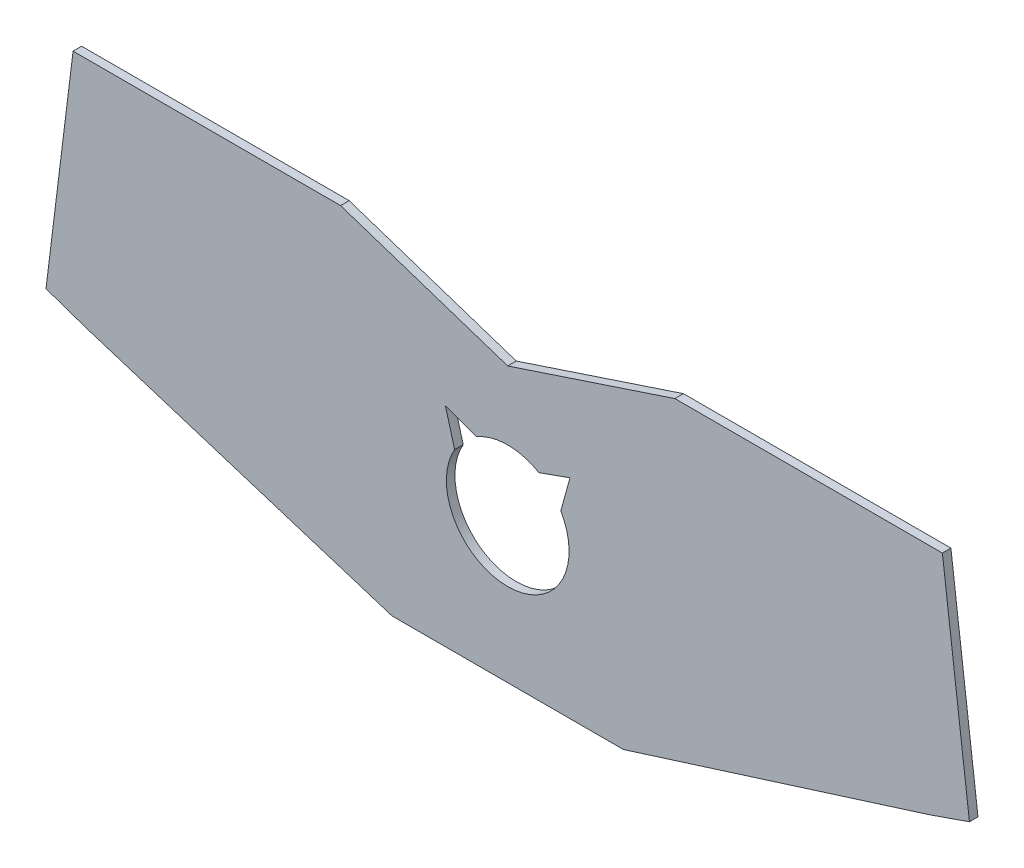
ISO-10303-21;
HEADER;
FILE_DESCRIPTION(('STEP AP214'),'2;1');
FILE_NAME('part.step','',(''),(''),'','','');
FILE_SCHEMA(('AUTOMOTIVE_DESIGN { 1 0 10303 214 1 1 1 1 }'));
ENDSEC;
DATA;
#1=APPLICATION_CONTEXT('core data for automotive mechanical design processes');
#2=APPLICATION_PROTOCOL_DEFINITION('international standard','automotive_design',2000,#1);
#3=PRODUCT_CONTEXT('',#1,'mechanical');
#4=PRODUCT('Part','Part','',(#3));
#5=PRODUCT_RELATED_PRODUCT_CATEGORY('part','',(#4));
#6=PRODUCT_DEFINITION_FORMATION('','',#4);
#7=PRODUCT_DEFINITION_CONTEXT('part definition',#1,'design');
#8=PRODUCT_DEFINITION('design','',#6,#7);
#9=PRODUCT_DEFINITION_SHAPE('','',#8);
#10=(LENGTH_UNIT() NAMED_UNIT(*) SI_UNIT(.MILLI.,.METRE.));
#11=(NAMED_UNIT(*) PLANE_ANGLE_UNIT() SI_UNIT($,.RADIAN.));
#12=(NAMED_UNIT(*) SI_UNIT($,.STERADIAN.) SOLID_ANGLE_UNIT());
#13=UNCERTAINTY_MEASURE_WITH_UNIT(LENGTH_MEASURE(1.E-05),#10,'distance_accuracy_value','');
#14=(GEOMETRIC_REPRESENTATION_CONTEXT(3) GLOBAL_UNCERTAINTY_ASSIGNED_CONTEXT((#13)) GLOBAL_UNIT_ASSIGNED_CONTEXT((#10,
#11,#12)) REPRESENTATION_CONTEXT('',''));
#15=CARTESIAN_POINT('',(0.,0.,0.));
#16=DIRECTION('',(0.,0.,1.));
#17=DIRECTION('',(1.,0.,0.));
#18=AXIS2_PLACEMENT_3D('',#15,#16,#17);
#19=CARTESIAN_POINT('',(0.,0.,3.));
#20=DIRECTION('',(0.,0.,1.));
#21=DIRECTION('',(1.,0.,0.));
#22=AXIS2_PLACEMENT_3D('',#19,#20,#21);
#23=PLANE('',#22);
#24=DIRECTION('',(0.944381210011735,0.328852748470757,0.));
#25=VECTOR('',#24,1.);
#26=CARTESIAN_POINT('',(162.,-18.92,3.));
#27=LINE('',#26,#25);
#28=CARTESIAN_POINT('',(148.354716995498,-23.671565122347,3.));
#29=VERTEX_POINT('',#28);
#30=CARTESIAN_POINT('',(162.,-18.92,3.));
#31=VERTEX_POINT('',#30);
#32=EDGE_CURVE('E205',#29,#31,#27,.T.);
#33=ORIENTED_EDGE('',*,*,#32,.T.);
#34=DIRECTION('',(-0.122573641444838,0.992459421045995,0.));
#35=VECTOR('',#34,1.);
#36=CARTESIAN_POINT('',(152.5,58.,3.));
#37=LINE('',#36,#35);
#38=CARTESIAN_POINT('',(152.5,58.,3.));
#39=VERTEX_POINT('',#38);
#40=EDGE_CURVE('E208',#31,#39,#37,.T.);
#41=ORIENTED_EDGE('',*,*,#40,.T.);
#42=DIRECTION('',(-1.,0.,0.));
#43=VECTOR('',#42,1.);
#44=CARTESIAN_POINT('',(152.5,58.,3.));
#45=LINE('',#44,#43);
#46=CARTESIAN_POINT('',(58.64,58.,3.));
#47=VERTEX_POINT('',#46);
#48=EDGE_CURVE('E211',#39,#47,#45,.T.);
#49=ORIENTED_EDGE('',*,*,#48,.T.);
#50=DIRECTION('',(-0.949344972569535,-0.314235776220578,0.));
#51=VECTOR('',#50,1.);
#52=CARTESIAN_POINT('',(58.64,58.,3.));
#53=LINE('',#52,#51);
#54=CARTESIAN_POINT('',(0.,38.59,3.));
#55=VERTEX_POINT('',#54);
#56=EDGE_CURVE('E213',#47,#55,#53,.T.);
#57=ORIENTED_EDGE('',*,*,#56,.T.);
#58=DIRECTION('',(-0.949344972569535,0.314235776220578,0.));
#59=VECTOR('',#58,1.);
#60=CARTESIAN_POINT('',(-58.64,58.,3.));
#61=LINE('',#60,#59);
#62=CARTESIAN_POINT('',(-58.64,58.,3.));
#63=VERTEX_POINT('',#62);
#64=EDGE_CURVE('E215',#55,#63,#61,.T.);
#65=ORIENTED_EDGE('',*,*,#64,.T.);
#66=DIRECTION('',(-1.,0.,0.));
#67=VECTOR('',#66,1.);
#68=CARTESIAN_POINT('',(-152.5,58.,3.));
#69=LINE('',#68,#67);
#70=CARTESIAN_POINT('',(-152.5,58.,3.));
#71=VERTEX_POINT('',#70);
#72=EDGE_CURVE('E217',#63,#71,#69,.T.);
#73=ORIENTED_EDGE('',*,*,#72,.T.);
#74=DIRECTION('',(-0.122573641444838,-0.992459421045995,0.));
#75=VECTOR('',#74,1.);
#76=CARTESIAN_POINT('',(-152.5,58.,3.));
#77=LINE('',#76,#75);
#78=CARTESIAN_POINT('',(-162.,-18.92,3.));
#79=VERTEX_POINT('',#78);
#80=EDGE_CURVE('E219',#71,#79,#77,.T.);
#81=ORIENTED_EDGE('',*,*,#80,.T.);
#82=DIRECTION('',(0.944381210011719,-0.328852748470804,0.));
#83=VECTOR('',#82,1.);
#84=CARTESIAN_POINT('',(-162.,-18.92,3.));
#85=LINE('',#84,#83);
#86=CARTESIAN_POINT('',(-148.354716995498,-23.6715651223478,3.));
#87=VERTEX_POINT('',#86);
#88=EDGE_CURVE('E221',#79,#87,#85,.T.);
#89=ORIENTED_EDGE('',*,*,#88,.T.);
#90=DIRECTION('',(0.953679087861579,-0.300825858887674,0.));
#91=VECTOR('',#90,1.);
#92=CARTESIAN_POINT('',(-148.354716995498,-23.6715651223478,3.));
#93=LINE('',#92,#91);
#94=CARTESIAN_POINT('',(-40.59713895926,-57.662313558589,3.));
#95=VERTEX_POINT('',#94);
#96=EDGE_CURVE('E223',#87,#95,#93,.T.);
#97=ORIENTED_EDGE('',*,*,#96,.T.);
#98=DIRECTION('',(1.,0.,0.));
#99=VECTOR('',#98,1.);
#100=CARTESIAN_POINT('',(-40.59713895926,-57.662313558589,3.));
#101=LINE('',#100,#99);
#102=CARTESIAN_POINT('',(40.59713895926,-57.662313558589,3.));
#103=VERTEX_POINT('',#102);
#104=EDGE_CURVE('E225',#95,#103,#101,.T.);
#105=ORIENTED_EDGE('',*,*,#104,.T.);
#106=DIRECTION('',(0.953679087861577,0.30082585888768,0.));
#107=VECTOR('',#106,1.);
#108=CARTESIAN_POINT('',(148.354716995498,-23.671565122347,3.));
#109=LINE('',#108,#107);
#110=EDGE_CURVE('E227',#103,#29,#109,.T.);
#111=ORIENTED_EDGE('',*,*,#110,.T.);
#112=EDGE_LOOP('',(#33,#41,#49,#57,#65,#73,#81,#89,#97,#105,#111));
#113=FACE_BOUND('',#112,.T.);
#114=CARTESIAN_POINT('',(0.,-6.92999999999999,3.));
#115=DIRECTION('',(0.,0.,1.));
#116=DIRECTION('',(1.,0.,0.));
#117=AXIS2_PLACEMENT_3D('',#114,#115,#116);
#118=CIRCLE('',#117,21.525);
#119=CARTESIAN_POINT('',(10.9081951411467,11.6263170850971,3.));
#120=VERTEX_POINT('',#119);
#121=CARTESIAN_POINT('',(-10.9081951411467,11.6263170850971,3.));
#122=VERTEX_POINT('',#121);
#123=EDGE_CURVE('E162',#120,#122,#118,.T.);
#124=ORIENTED_EDGE('',*,*,#123,.F.);
#125=DIRECTION('',(-0.94229112833764,-0.334794607866043,0.));
#126=VECTOR('',#125,1.);
#127=CARTESIAN_POINT('',(10.9081951411467,11.6263170850971,3.));
#128=LINE('',#127,#126);
#129=CARTESIAN_POINT('',(21.8481951411467,15.5132824824218,3.));
#130=VERTEX_POINT('',#129);
#131=EDGE_CURVE('E154',#130,#120,#128,.T.);
#132=ORIENTED_EDGE('',*,*,#131,.F.);
#133=DIRECTION('',(0.267434077712005,0.963576158940397,0.));
#134=VECTOR('',#133,1.);
#135=CARTESIAN_POINT('',(21.8481951411467,15.5132824824218,3.));
#136=LINE('',#135,#134);
#137=CARTESIAN_POINT('',(18.6175914823856,3.87328248242181,3.));
#138=VERTEX_POINT('',#137);
#139=EDGE_CURVE('E183',#138,#130,#136,.T.);
#140=ORIENTED_EDGE('',*,*,#139,.F.);
#141=CARTESIAN_POINT('',(0.,-6.92999999999999,3.));
#142=DIRECTION('',(0.,0.,1.));
#143=DIRECTION('',(1.,0.,0.));
#144=AXIS2_PLACEMENT_3D('',#141,#142,#143);
#145=CIRCLE('',#144,21.525);
#146=CARTESIAN_POINT('',(-18.6175914823856,3.87328248242181,3.));
#147=VERTEX_POINT('',#146);
#148=EDGE_CURVE('E181',#147,#138,#145,.T.);
#149=ORIENTED_EDGE('',*,*,#148,.F.);
#150=DIRECTION('',(0.267434077712005,-0.963576158940397,0.));
#151=VECTOR('',#150,1.);
#152=CARTESIAN_POINT('',(-21.8481951411467,15.5132824824218,3.));
#153=LINE('',#152,#151);
#154=CARTESIAN_POINT('',(-21.8481951411467,15.5132824824218,3.));
#155=VERTEX_POINT('',#154);
#156=EDGE_CURVE('E177',#155,#147,#153,.T.);
#157=ORIENTED_EDGE('',*,*,#156,.F.);
#158=DIRECTION('',(-0.94229112833764,0.334794607866043,0.));
#159=VECTOR('',#158,1.);
#160=CARTESIAN_POINT('',(-10.9081951411467,11.6263170850971,3.));
#161=LINE('',#160,#159);
#162=EDGE_CURVE('E175',#122,#155,#161,.T.);
#163=ORIENTED_EDGE('',*,*,#162,.F.);
#164=EDGE_LOOP('',(#124,#132,#140,#149,#157,#163));
#165=FACE_BOUND('',#164,.T.);
#166=ADVANCED_FACE('F35',(#113,#165),#23,.T.);
#167=CARTESIAN_POINT('',(0.,0.,0.));
#168=DIRECTION('',(0.,0.,1.));
#169=DIRECTION('',(1.,0.,0.));
#170=AXIS2_PLACEMENT_3D('',#167,#168,#169);
#171=PLANE('',#170);
#172=DIRECTION('',(0.944381210011735,0.328852748470757,0.));
#173=VECTOR('',#172,1.);
#174=CARTESIAN_POINT('',(162.,-18.92,0.));
#175=LINE('',#174,#173);
#176=CARTESIAN_POINT('',(148.354716995498,-23.671565122347,0.));
#177=VERTEX_POINT('',#176);
#178=CARTESIAN_POINT('',(162.,-18.92,0.));
#179=VERTEX_POINT('',#178);
#180=EDGE_CURVE('E170',#177,#179,#175,.T.);
#181=ORIENTED_EDGE('',*,*,#180,.F.);
#182=DIRECTION('',(0.953679087861577,0.30082585888768,0.));
#183=VECTOR('',#182,1.);
#184=CARTESIAN_POINT('',(148.354716995498,-23.671565122347,0.));
#185=LINE('',#184,#183);
#186=CARTESIAN_POINT('',(40.59713895926,-57.662313558589,0.));
#187=VERTEX_POINT('',#186);
#188=EDGE_CURVE('E209',#187,#177,#185,.T.);
#189=ORIENTED_EDGE('',*,*,#188,.F.);
#190=DIRECTION('',(1.,0.,0.));
#191=VECTOR('',#190,1.);
#192=CARTESIAN_POINT('',(-40.59713895926,-57.662313558589,0.));
#193=LINE('',#192,#191);
#194=CARTESIAN_POINT('',(-40.59713895926,-57.662313558589,0.));
#195=VERTEX_POINT('',#194);
#196=EDGE_CURVE('E248',#195,#187,#193,.T.);
#197=ORIENTED_EDGE('',*,*,#196,.F.);
#198=DIRECTION('',(0.953679087861579,-0.300825858887674,0.));
#199=VECTOR('',#198,1.);
#200=CARTESIAN_POINT('',(-148.354716995498,-23.6715651223478,0.));
#201=LINE('',#200,#199);
#202=CARTESIAN_POINT('',(-148.354716995498,-23.6715651223478,0.));
#203=VERTEX_POINT('',#202);
#204=EDGE_CURVE('E246',#203,#195,#201,.T.);
#205=ORIENTED_EDGE('',*,*,#204,.F.);
#206=DIRECTION('',(0.944381210011719,-0.328852748470804,0.));
#207=VECTOR('',#206,1.);
#208=CARTESIAN_POINT('',(-162.,-18.92,0.));
#209=LINE('',#208,#207);
#210=CARTESIAN_POINT('',(-162.,-18.92,0.));
#211=VERTEX_POINT('',#210);
#212=EDGE_CURVE('E244',#211,#203,#209,.T.);
#213=ORIENTED_EDGE('',*,*,#212,.F.);
#214=DIRECTION('',(-0.122573641444838,-0.992459421045995,0.));
#215=VECTOR('',#214,1.);
#216=CARTESIAN_POINT('',(-152.5,58.,0.));
#217=LINE('',#216,#215);
#218=CARTESIAN_POINT('',(-152.5,58.,0.));
#219=VERTEX_POINT('',#218);
#220=EDGE_CURVE('E242',#219,#211,#217,.T.);
#221=ORIENTED_EDGE('',*,*,#220,.F.);
#222=DIRECTION('',(-1.,0.,0.));
#223=VECTOR('',#222,1.);
#224=CARTESIAN_POINT('',(-152.5,58.,0.));
#225=LINE('',#224,#223);
#226=CARTESIAN_POINT('',(-58.64,58.,0.));
#227=VERTEX_POINT('',#226);
#228=EDGE_CURVE('E240',#227,#219,#225,.T.);
#229=ORIENTED_EDGE('',*,*,#228,.F.);
#230=DIRECTION('',(-0.949344972569535,0.314235776220578,0.));
#231=VECTOR('',#230,1.);
#232=CARTESIAN_POINT('',(-58.64,58.,0.));
#233=LINE('',#232,#231);
#234=CARTESIAN_POINT('',(0.,38.59,0.));
#235=VERTEX_POINT('',#234);
#236=EDGE_CURVE('E238',#235,#227,#233,.T.);
#237=ORIENTED_EDGE('',*,*,#236,.F.);
#238=DIRECTION('',(-0.949344972569535,-0.314235776220578,0.));
#239=VECTOR('',#238,1.);
#240=CARTESIAN_POINT('',(58.64,58.,0.));
#241=LINE('',#240,#239);
#242=CARTESIAN_POINT('',(58.64,58.,0.));
#243=VERTEX_POINT('',#242);
#244=EDGE_CURVE('E236',#243,#235,#241,.T.);
#245=ORIENTED_EDGE('',*,*,#244,.F.);
#246=DIRECTION('',(-1.,0.,0.));
#247=VECTOR('',#246,1.);
#248=CARTESIAN_POINT('',(152.5,58.,0.));
#249=LINE('',#248,#247);
#250=CARTESIAN_POINT('',(152.5,58.,0.));
#251=VERTEX_POINT('',#250);
#252=EDGE_CURVE('E234',#251,#243,#249,.T.);
#253=ORIENTED_EDGE('',*,*,#252,.F.);
#254=DIRECTION('',(-0.122573641444838,0.992459421045995,0.));
#255=VECTOR('',#254,1.);
#256=CARTESIAN_POINT('',(152.5,58.,0.));
#257=LINE('',#256,#255);
#258=EDGE_CURVE('E232',#179,#251,#257,.T.);
#259=ORIENTED_EDGE('',*,*,#258,.F.);
#260=EDGE_LOOP('',(#181,#189,#197,#205,#213,#221,#229,#237,#245,#253,#259));
#261=FACE_BOUND('',#260,.T.);
#262=DIRECTION('',(-0.94229112833764,-0.334794607866043,0.));
#263=VECTOR('',#262,1.);
#264=CARTESIAN_POINT('',(10.9081951411467,11.6263170850971,0.));
#265=LINE('',#264,#263);
#266=CARTESIAN_POINT('',(21.8481951411467,15.5132824824218,0.));
#267=VERTEX_POINT('',#266);
#268=CARTESIAN_POINT('',(10.9081951411467,11.6263170850971,0.));
#269=VERTEX_POINT('',#268);
#270=EDGE_CURVE('E58',#267,#269,#265,.T.);
#271=ORIENTED_EDGE('',*,*,#270,.T.);
#272=CARTESIAN_POINT('',(0.,-6.92999999999999,0.));
#273=DIRECTION('',(0.,0.,1.));
#274=DIRECTION('',(1.,0.,0.));
#275=AXIS2_PLACEMENT_3D('',#272,#273,#274);
#276=CIRCLE('',#275,21.525);
#277=CARTESIAN_POINT('',(-10.9081951411467,11.6263170850971,0.));
#278=VERTEX_POINT('',#277);
#279=EDGE_CURVE('E169',#269,#278,#276,.T.);
#280=ORIENTED_EDGE('',*,*,#279,.T.);
#281=DIRECTION('',(-0.94229112833764,0.334794607866043,0.));
#282=VECTOR('',#281,1.);
#283=CARTESIAN_POINT('',(-10.9081951411467,11.6263170850971,0.));
#284=LINE('',#283,#282);
#285=CARTESIAN_POINT('',(-21.8481951411467,15.5132824824218,0.));
#286=VERTEX_POINT('',#285);
#287=EDGE_CURVE('E187',#278,#286,#284,.T.);
#288=ORIENTED_EDGE('',*,*,#287,.T.);
#289=DIRECTION('',(0.267434077712005,-0.963576158940397,0.));
#290=VECTOR('',#289,1.);
#291=CARTESIAN_POINT('',(-21.8481951411467,15.5132824824218,0.));
#292=LINE('',#291,#290);
#293=CARTESIAN_POINT('',(-18.6175914823856,3.87328248242181,0.));
#294=VERTEX_POINT('',#293);
#295=EDGE_CURVE('E190',#286,#294,#292,.T.);
#296=ORIENTED_EDGE('',*,*,#295,.T.);
#297=CARTESIAN_POINT('',(0.,-6.92999999999999,0.));
#298=DIRECTION('',(0.,0.,1.));
#299=DIRECTION('',(1.,0.,0.));
#300=AXIS2_PLACEMENT_3D('',#297,#298,#299);
#301=CIRCLE('',#300,21.525);
#302=CARTESIAN_POINT('',(18.6175914823856,3.87328248242181,0.));
#303=VERTEX_POINT('',#302);
#304=EDGE_CURVE('E193',#294,#303,#301,.T.);
#305=ORIENTED_EDGE('',*,*,#304,.T.);
#306=DIRECTION('',(0.267434077712005,0.963576158940397,0.));
#307=VECTOR('',#306,1.);
#308=CARTESIAN_POINT('',(21.8481951411467,15.5132824824218,0.));
#309=LINE('',#308,#307);
#310=EDGE_CURVE('E163',#303,#267,#309,.T.);
#311=ORIENTED_EDGE('',*,*,#310,.T.);
#312=EDGE_LOOP('',(#271,#280,#288,#296,#305,#311));
#313=FACE_BOUND('',#312,.T.);
#314=ADVANCED_FACE('F287',(#261,#313),#171,.F.);
#315=CARTESIAN_POINT('',(162.,-18.92,3.));
#316=DIRECTION('',(-0.328852748470757,0.944381210011735,0.));
#317=DIRECTION('',(-0.944381210011735,-0.328852748470757,0.));
#318=AXIS2_PLACEMENT_3D('',#315,#316,#317);
#319=PLANE('',#318);
#320=ORIENTED_EDGE('',*,*,#180,.T.);
#321=DIRECTION('',(0.,0.,-1.));
#322=VECTOR('',#321,1.);
#323=CARTESIAN_POINT('',(162.,-18.92,3.));
#324=LINE('',#323,#322);
#325=EDGE_CURVE('E11',#31,#179,#324,.T.);
#326=ORIENTED_EDGE('',*,*,#325,.F.);
#327=ORIENTED_EDGE('',*,*,#32,.F.);
#328=DIRECTION('',(0.,0.,-1.));
#329=VECTOR('',#328,1.);
#330=CARTESIAN_POINT('',(148.354716995498,-23.671565122347,3.));
#331=LINE('',#330,#329);
#332=EDGE_CURVE('E229',#29,#177,#331,.T.);
#333=ORIENTED_EDGE('',*,*,#332,.T.);
#334=EDGE_LOOP('',(#320,#326,#327,#333));
#335=FACE_BOUND('',#334,.T.);
#336=ADVANCED_FACE('F37',(#335),#319,.F.);
#337=CARTESIAN_POINT('',(152.5,58.,3.));
#338=DIRECTION('',(-0.992459421045995,-0.122573641444838,0.));
#339=DIRECTION('',(0.122573641444838,-0.992459421045995,0.));
#340=AXIS2_PLACEMENT_3D('',#337,#338,#339);
#341=PLANE('',#340);
#342=ORIENTED_EDGE('',*,*,#258,.T.);
#343=DIRECTION('',(0.,0.,-1.));
#344=VECTOR('',#343,1.);
#345=CARTESIAN_POINT('',(152.5,58.,3.));
#346=LINE('',#345,#344);
#347=EDGE_CURVE('E43',#39,#251,#346,.T.);
#348=ORIENTED_EDGE('',*,*,#347,.F.);
#349=ORIENTED_EDGE('',*,*,#40,.F.);
#350=ORIENTED_EDGE('',*,*,#325,.T.);
#351=EDGE_LOOP('',(#342,#348,#349,#350));
#352=FACE_BOUND('',#351,.T.);
#353=ADVANCED_FACE('F304',(#352),#341,.F.);
#354=CARTESIAN_POINT('',(152.5,58.,3.));
#355=DIRECTION('',(0.,-1.,0.));
#356=DIRECTION('',(0.,0.,-1.));
#357=AXIS2_PLACEMENT_3D('',#354,#355,#356);
#358=PLANE('',#357);
#359=ORIENTED_EDGE('',*,*,#252,.T.);
#360=DIRECTION('',(0.,0.,-1.));
#361=VECTOR('',#360,1.);
#362=CARTESIAN_POINT('',(58.64,58.,3.));
#363=LINE('',#362,#361);
#364=EDGE_CURVE('E274',#47,#243,#363,.T.);
#365=ORIENTED_EDGE('',*,*,#364,.F.);
#366=ORIENTED_EDGE('',*,*,#48,.F.);
#367=ORIENTED_EDGE('',*,*,#347,.T.);
#368=EDGE_LOOP('',(#359,#365,#366,#367));
#369=FACE_BOUND('',#368,.T.);
#370=ADVANCED_FACE('F281',(#369),#358,.F.);
#371=CARTESIAN_POINT('',(58.64,58.,3.));
#372=DIRECTION('',(0.314235776220578,-0.949344972569535,0.));
#373=DIRECTION('',(0.949344972569535,0.314235776220578,0.));
#374=AXIS2_PLACEMENT_3D('',#371,#372,#373);
#375=PLANE('',#374);
#376=ORIENTED_EDGE('',*,*,#244,.T.);
#377=DIRECTION('',(0.,0.,-1.));
#378=VECTOR('',#377,1.);
#379=CARTESIAN_POINT('',(0.,38.59,3.));
#380=LINE('',#379,#378);
#381=EDGE_CURVE('E271',#55,#235,#380,.T.);
#382=ORIENTED_EDGE('',*,*,#381,.F.);
#383=ORIENTED_EDGE('',*,*,#56,.F.);
#384=ORIENTED_EDGE('',*,*,#364,.T.);
#385=EDGE_LOOP('',(#376,#382,#383,#384));
#386=FACE_BOUND('',#385,.T.);
#387=ADVANCED_FACE('F293',(#386),#375,.F.);
#388=CARTESIAN_POINT('',(-58.64,58.,3.));
#389=DIRECTION('',(-0.314235776220578,-0.949344972569535,0.));
#390=DIRECTION('',(0.949344972569535,-0.314235776220578,0.));
#391=AXIS2_PLACEMENT_3D('',#388,#389,#390);
#392=PLANE('',#391);
#393=ORIENTED_EDGE('',*,*,#236,.T.);
#394=DIRECTION('',(0.,0.,-1.));
#395=VECTOR('',#394,1.);
#396=CARTESIAN_POINT('',(-58.64,58.,3.));
#397=LINE('',#396,#395);
#398=EDGE_CURVE('E268',#63,#227,#397,.T.);
#399=ORIENTED_EDGE('',*,*,#398,.F.);
#400=ORIENTED_EDGE('',*,*,#64,.F.);
#401=ORIENTED_EDGE('',*,*,#381,.T.);
#402=EDGE_LOOP('',(#393,#399,#400,#401));
#403=FACE_BOUND('',#402,.T.);
#404=ADVANCED_FACE('F297',(#403),#392,.F.);
#405=CARTESIAN_POINT('',(-152.5,58.,3.));
#406=DIRECTION('',(0.,-1.,0.));
#407=DIRECTION('',(0.,0.,-1.));
#408=AXIS2_PLACEMENT_3D('',#405,#406,#407);
#409=PLANE('',#408);
#410=ORIENTED_EDGE('',*,*,#228,.T.);
#411=DIRECTION('',(0.,0.,-1.));
#412=VECTOR('',#411,1.);
#413=CARTESIAN_POINT('',(-152.5,58.,3.));
#414=LINE('',#413,#412);
#415=EDGE_CURVE('E265',#71,#219,#414,.T.);
#416=ORIENTED_EDGE('',*,*,#415,.F.);
#417=ORIENTED_EDGE('',*,*,#72,.F.);
#418=ORIENTED_EDGE('',*,*,#398,.T.);
#419=EDGE_LOOP('',(#410,#416,#417,#418));
#420=FACE_BOUND('',#419,.T.);
#421=ADVANCED_FACE('F332',(#420),#409,.F.);
#422=CARTESIAN_POINT('',(-152.5,58.,3.));
#423=DIRECTION('',(0.992459421045995,-0.122573641444838,0.));
#424=DIRECTION('',(0.122573641444838,0.992459421045995,0.));
#425=AXIS2_PLACEMENT_3D('',#422,#423,#424);
#426=PLANE('',#425);
#427=ORIENTED_EDGE('',*,*,#220,.T.);
#428=DIRECTION('',(0.,0.,-1.));
#429=VECTOR('',#428,1.);
#430=CARTESIAN_POINT('',(-162.,-18.92,3.));
#431=LINE('',#430,#429);
#432=EDGE_CURVE('E262',#79,#211,#431,.T.);
#433=ORIENTED_EDGE('',*,*,#432,.F.);
#434=ORIENTED_EDGE('',*,*,#80,.F.);
#435=ORIENTED_EDGE('',*,*,#415,.T.);
#436=EDGE_LOOP('',(#427,#433,#434,#435));
#437=FACE_BOUND('',#436,.T.);
#438=ADVANCED_FACE('F330',(#437),#426,.F.);
#439=CARTESIAN_POINT('',(-162.,-18.92,3.));
#440=DIRECTION('',(0.328852748470804,0.944381210011719,0.));
#441=DIRECTION('',(-0.944381210011719,0.328852748470804,0.));
#442=AXIS2_PLACEMENT_3D('',#439,#440,#441);
#443=PLANE('',#442);
#444=ORIENTED_EDGE('',*,*,#212,.T.);
#445=DIRECTION('',(0.,0.,-1.));
#446=VECTOR('',#445,1.);
#447=CARTESIAN_POINT('',(-148.354716995498,-23.6715651223478,3.));
#448=LINE('',#447,#446);
#449=EDGE_CURVE('E259',#87,#203,#448,.T.);
#450=ORIENTED_EDGE('',*,*,#449,.F.);
#451=ORIENTED_EDGE('',*,*,#88,.F.);
#452=ORIENTED_EDGE('',*,*,#432,.T.);
#453=EDGE_LOOP('',(#444,#450,#451,#452));
#454=FACE_BOUND('',#453,.T.);
#455=ADVANCED_FACE('F325',(#454),#443,.F.);
#456=CARTESIAN_POINT('',(-148.354716995498,-23.6715651223478,3.));
#457=DIRECTION('',(0.300825858887674,0.953679087861579,0.));
#458=DIRECTION('',(-0.953679087861579,0.300825858887674,0.));
#459=AXIS2_PLACEMENT_3D('',#456,#457,#458);
#460=PLANE('',#459);
#461=ORIENTED_EDGE('',*,*,#204,.T.);
#462=DIRECTION('',(0.,0.,-1.));
#463=VECTOR('',#462,1.);
#464=CARTESIAN_POINT('',(-40.59713895926,-57.662313558589,3.));
#465=LINE('',#464,#463);
#466=EDGE_CURVE('E256',#95,#195,#465,.T.);
#467=ORIENTED_EDGE('',*,*,#466,.F.);
#468=ORIENTED_EDGE('',*,*,#96,.F.);
#469=ORIENTED_EDGE('',*,*,#449,.T.);
#470=EDGE_LOOP('',(#461,#467,#468,#469));
#471=FACE_BOUND('',#470,.T.);
#472=ADVANCED_FACE('F320',(#471),#460,.F.);
#473=CARTESIAN_POINT('',(-40.59713895926,-57.662313558589,3.));
#474=DIRECTION('',(0.,1.,0.));
#475=DIRECTION('',(0.,0.,1.));
#476=AXIS2_PLACEMENT_3D('',#473,#474,#475);
#477=PLANE('',#476);
#478=ORIENTED_EDGE('',*,*,#196,.T.);
#479=DIRECTION('',(0.,0.,-1.));
#480=VECTOR('',#479,1.);
#481=CARTESIAN_POINT('',(40.59713895926,-57.662313558589,3.));
#482=LINE('',#481,#480);
#483=EDGE_CURVE('E253',#103,#187,#482,.T.);
#484=ORIENTED_EDGE('',*,*,#483,.F.);
#485=ORIENTED_EDGE('',*,*,#104,.F.);
#486=ORIENTED_EDGE('',*,*,#466,.T.);
#487=EDGE_LOOP('',(#478,#484,#485,#486));
#488=FACE_BOUND('',#487,.T.);
#489=ADVANCED_FACE('F316',(#488),#477,.F.);
#490=CARTESIAN_POINT('',(148.354716995498,-23.671565122347,3.));
#491=DIRECTION('',(-0.30082585888768,0.953679087861577,0.));
#492=DIRECTION('',(-0.953679087861577,-0.30082585888768,0.));
#493=AXIS2_PLACEMENT_3D('',#490,#491,#492);
#494=PLANE('',#493);
#495=ORIENTED_EDGE('',*,*,#188,.T.);
#496=ORIENTED_EDGE('',*,*,#332,.F.);
#497=ORIENTED_EDGE('',*,*,#110,.F.);
#498=ORIENTED_EDGE('',*,*,#483,.T.);
#499=EDGE_LOOP('',(#495,#496,#497,#498));
#500=FACE_BOUND('',#499,.T.);
#501=ADVANCED_FACE('F311',(#500),#494,.F.);
#502=CARTESIAN_POINT('',(10.9081951411467,11.6263170850971,3.));
#503=DIRECTION('',(0.334794607866043,-0.94229112833764,0.));
#504=DIRECTION('',(0.94229112833764,0.334794607866043,0.));
#505=AXIS2_PLACEMENT_3D('',#502,#503,#504);
#506=PLANE('',#505);
#507=ORIENTED_EDGE('',*,*,#270,.F.);
#508=DIRECTION('',(0.,0.,-1.));
#509=VECTOR('',#508,1.);
#510=CARTESIAN_POINT('',(21.8481951411467,15.5132824824218,3.));
#511=LINE('',#510,#509);
#512=EDGE_CURVE('E158',#130,#267,#511,.T.);
#513=ORIENTED_EDGE('',*,*,#512,.F.);
#514=ORIENTED_EDGE('',*,*,#131,.T.);
#515=DIRECTION('',(0.,0.,-1.));
#516=VECTOR('',#515,1.);
#517=CARTESIAN_POINT('',(10.9081951411467,11.6263170850971,3.));
#518=LINE('',#517,#516);
#519=EDGE_CURVE('E157',#120,#269,#518,.T.);
#520=ORIENTED_EDGE('',*,*,#519,.T.);
#521=EDGE_LOOP('',(#507,#513,#514,#520));
#522=FACE_BOUND('',#521,.T.);
#523=ADVANCED_FACE('F156',(#522),#506,.T.);
#524=CARTESIAN_POINT('',(0.,-6.92999999999999,3.));
#525=DIRECTION('',(0.,0.,-1.));
#526=DIRECTION('',(-1.,0.,0.));
#527=AXIS2_PLACEMENT_3D('',#524,#525,#526);
#528=CYLINDRICAL_SURFACE('',#527,21.525);
#529=ORIENTED_EDGE('',*,*,#279,.F.);
#530=ORIENTED_EDGE('',*,*,#519,.F.);
#531=ORIENTED_EDGE('',*,*,#123,.T.);
#532=DIRECTION('',(0.,0.,-1.));
#533=VECTOR('',#532,1.);
#534=CARTESIAN_POINT('',(-10.9081951411467,11.6263170850971,3.));
#535=LINE('',#534,#533);
#536=EDGE_CURVE('E171',#122,#278,#535,.T.);
#537=ORIENTED_EDGE('',*,*,#536,.T.);
#538=EDGE_LOOP('',(#529,#530,#531,#537));
#539=FACE_BOUND('',#538,.T.);
#540=ADVANCED_FACE('F166',(#539),#528,.F.);
#541=CARTESIAN_POINT('',(-10.9081951411467,11.6263170850971,3.));
#542=DIRECTION('',(-0.334794607866043,-0.94229112833764,0.));
#543=DIRECTION('',(0.94229112833764,-0.334794607866043,0.));
#544=AXIS2_PLACEMENT_3D('',#541,#542,#543);
#545=PLANE('',#544);
#546=ORIENTED_EDGE('',*,*,#287,.F.);
#547=ORIENTED_EDGE('',*,*,#536,.F.);
#548=ORIENTED_EDGE('',*,*,#162,.T.);
#549=DIRECTION('',(0.,0.,-1.));
#550=VECTOR('',#549,1.);
#551=CARTESIAN_POINT('',(-21.8481951411467,15.5132824824218,3.));
#552=LINE('',#551,#550);
#553=EDGE_CURVE('E202',#155,#286,#552,.T.);
#554=ORIENTED_EDGE('',*,*,#553,.T.);
#555=EDGE_LOOP('',(#546,#547,#548,#554));
#556=FACE_BOUND('',#555,.T.);
#557=ADVANCED_FACE('F384',(#556),#545,.T.);
#558=CARTESIAN_POINT('',(-21.8481951411467,15.5132824824218,3.));
#559=DIRECTION('',(0.963576158940397,0.267434077712005,0.));
#560=DIRECTION('',(-0.267434077712005,0.963576158940397,0.));
#561=AXIS2_PLACEMENT_3D('',#558,#559,#560);
#562=PLANE('',#561);
#563=ORIENTED_EDGE('',*,*,#295,.F.);
#564=ORIENTED_EDGE('',*,*,#553,.F.);
#565=ORIENTED_EDGE('',*,*,#156,.T.);
#566=DIRECTION('',(0.,0.,-1.));
#567=VECTOR('',#566,1.);
#568=CARTESIAN_POINT('',(-18.6175914823856,3.87328248242181,3.));
#569=LINE('',#568,#567);
#570=EDGE_CURVE('E200',#147,#294,#569,.T.);
#571=ORIENTED_EDGE('',*,*,#570,.T.);
#572=EDGE_LOOP('',(#563,#564,#565,#571));
#573=FACE_BOUND('',#572,.T.);
#574=ADVANCED_FACE('F390',(#573),#562,.T.);
#575=CARTESIAN_POINT('',(0.,-6.92999999999999,3.));
#576=DIRECTION('',(0.,0.,-1.));
#577=DIRECTION('',(-1.,0.,0.));
#578=AXIS2_PLACEMENT_3D('',#575,#576,#577);
#579=CYLINDRICAL_SURFACE('',#578,21.525);
#580=ORIENTED_EDGE('',*,*,#304,.F.);
#581=ORIENTED_EDGE('',*,*,#570,.F.);
#582=ORIENTED_EDGE('',*,*,#148,.T.);
#583=DIRECTION('',(0.,0.,-1.));
#584=VECTOR('',#583,1.);
#585=CARTESIAN_POINT('',(18.6175914823856,3.87328248242181,3.));
#586=LINE('',#585,#584);
#587=EDGE_CURVE('E50',#138,#303,#586,.T.);
#588=ORIENTED_EDGE('',*,*,#587,.T.);
#589=EDGE_LOOP('',(#580,#581,#582,#588));
#590=FACE_BOUND('',#589,.T.);
#591=ADVANCED_FACE('F398',(#590),#579,.F.);
#592=CARTESIAN_POINT('',(21.8481951411467,15.5132824824218,3.));
#593=DIRECTION('',(-0.963576158940397,0.267434077712005,0.));
#594=DIRECTION('',(-0.267434077712005,-0.963576158940397,0.));
#595=AXIS2_PLACEMENT_3D('',#592,#593,#594);
#596=PLANE('',#595);
#597=ORIENTED_EDGE('',*,*,#310,.F.);
#598=ORIENTED_EDGE('',*,*,#587,.F.);
#599=ORIENTED_EDGE('',*,*,#139,.T.);
#600=ORIENTED_EDGE('',*,*,#512,.T.);
#601=EDGE_LOOP('',(#597,#598,#599,#600));
#602=FACE_BOUND('',#601,.T.);
#603=ADVANCED_FACE('F406',(#602),#596,.T.);
#604=CLOSED_SHELL('',(#166,#314,#336,#353,#370,#387,#404,#421,#438,#455,#472,#489,#501,#523,
#540,#557,#574,#591,#603));
#605=MANIFOLD_SOLID_BREP('B2',#604);
#606=ADVANCED_BREP_SHAPE_REPRESENTATION('',(#18,#605),#14);
#607=SHAPE_DEFINITION_REPRESENTATION(#9,#606);
ENDSEC;
END-ISO-10303-21;
